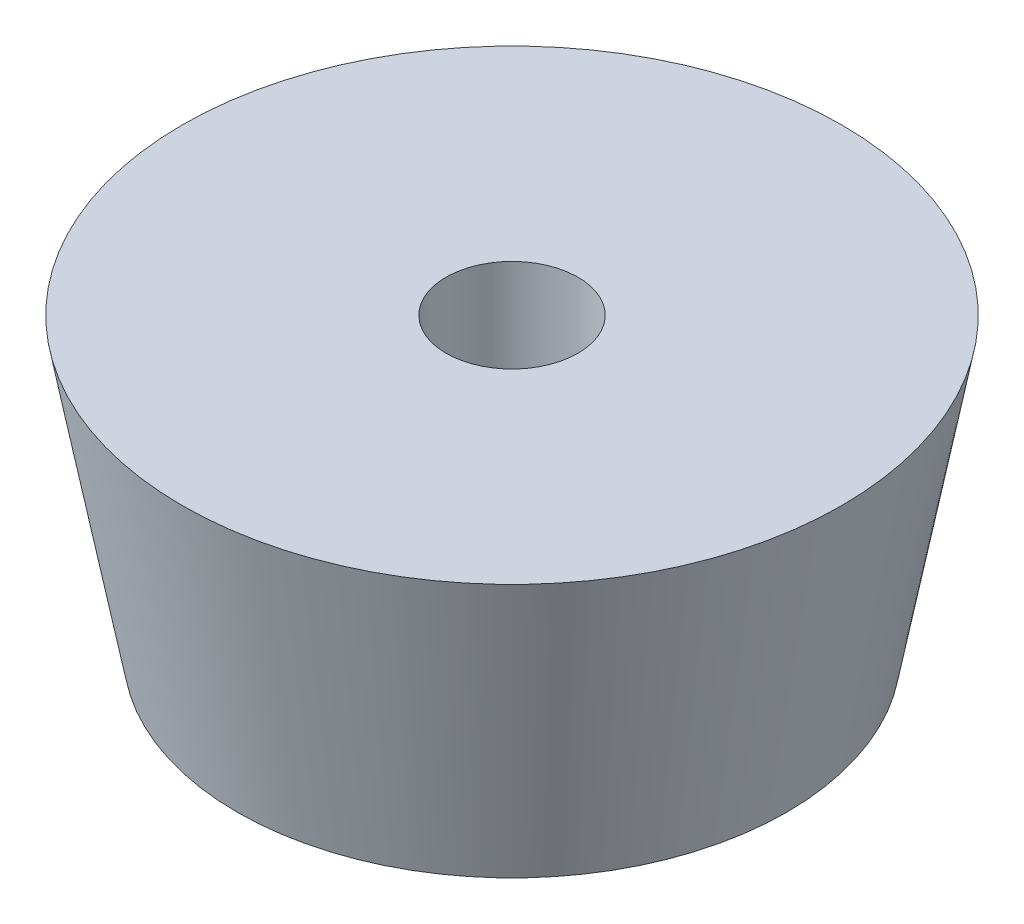
ISO-10303-21;
HEADER;
FILE_DESCRIPTION(('STEP AP214'),'2;1');
FILE_NAME('part.step','',(''),(''),'','','');
FILE_SCHEMA(('AUTOMOTIVE_DESIGN { 1 0 10303 214 1 1 1 1 }'));
ENDSEC;
DATA;
#1=APPLICATION_CONTEXT('core data for automotive mechanical design processes');
#2=APPLICATION_PROTOCOL_DEFINITION('international standard','automotive_design',2000,#1);
#3=PRODUCT_CONTEXT('',#1,'mechanical');
#4=PRODUCT('Part','Part','',(#3));
#5=PRODUCT_RELATED_PRODUCT_CATEGORY('part','',(#4));
#6=PRODUCT_DEFINITION_FORMATION('','',#4);
#7=PRODUCT_DEFINITION_CONTEXT('part definition',#1,'design');
#8=PRODUCT_DEFINITION('design','',#6,#7);
#9=PRODUCT_DEFINITION_SHAPE('','',#8);
#10=(LENGTH_UNIT() NAMED_UNIT(*) SI_UNIT(.MILLI.,.METRE.));
#11=(NAMED_UNIT(*) PLANE_ANGLE_UNIT() SI_UNIT($,.RADIAN.));
#12=(NAMED_UNIT(*) SI_UNIT($,.STERADIAN.) SOLID_ANGLE_UNIT());
#13=UNCERTAINTY_MEASURE_WITH_UNIT(LENGTH_MEASURE(1.E-05),#10,'distance_accuracy_value','');
#14=(GEOMETRIC_REPRESENTATION_CONTEXT(3) GLOBAL_UNCERTAINTY_ASSIGNED_CONTEXT((#13)) GLOBAL_UNIT_ASSIGNED_CONTEXT((#10,
#11,#12)) REPRESENTATION_CONTEXT('',''));
#15=CARTESIAN_POINT('',(0.,0.,0.));
#16=DIRECTION('',(0.,0.,1.));
#17=DIRECTION('',(1.,0.,0.));
#18=AXIS2_PLACEMENT_3D('',#15,#16,#17);
#19=CARTESIAN_POINT('',(-7.5,0.,0.));
#20=DIRECTION('',(0.,1.,0.));
#21=DIRECTION('',(-1.,0.,0.));
#22=AXIS2_PLACEMENT_3D('',#19,#20,#21);
#23=PLANE('',#22);
#24=CARTESIAN_POINT('',(0.,0.,0.));
#25=DIRECTION('',(0.,-1.,0.));
#26=DIRECTION('',(1.,0.,0.));
#27=AXIS2_PLACEMENT_3D('',#24,#25,#26);
#28=CIRCLE('',#27,4.);
#29=CARTESIAN_POINT('',(4.,0.,0.));
#30=VERTEX_POINT('',#29);
#31=EDGE_CURVE('E10',#30,#30,#28,.T.);
#32=ORIENTED_EDGE('',*,*,#31,.F.);
#33=EDGE_LOOP('',(#32));
#34=FACE_BOUND('',#33,.T.);
#35=CARTESIAN_POINT('',(0.,0.,0.));
#36=DIRECTION('',(0.,-1.,0.));
#37=DIRECTION('',(1.,0.,0.));
#38=AXIS2_PLACEMENT_3D('',#35,#36,#37);
#39=CIRCLE('',#38,7.5);
#40=CARTESIAN_POINT('',(7.5,0.,0.));
#41=VERTEX_POINT('',#40);
#42=EDGE_CURVE('E54',#41,#41,#39,.T.);
#43=ORIENTED_EDGE('',*,*,#42,.T.);
#44=EDGE_LOOP('',(#43));
#45=FACE_BOUND('',#44,.T.);
#46=ADVANCED_FACE('F32',(#34,#45),#23,.F.);
#47=CARTESIAN_POINT('',(0.,0.,0.));
#48=DIRECTION('',(0.,-1.,0.));
#49=DIRECTION('',(1.,0.,0.));
#50=AXIS2_PLACEMENT_3D('',#47,#48,#49);
#51=CYLINDRICAL_SURFACE('',#50,4.);
#52=CARTESIAN_POINT('',(0.,4.,0.));
#53=DIRECTION('',(0.,-1.,0.));
#54=DIRECTION('',(1.,0.,0.));
#55=AXIS2_PLACEMENT_3D('',#52,#53,#54);
#56=CIRCLE('',#55,4.);
#57=CARTESIAN_POINT('',(4.,4.,0.));
#58=VERTEX_POINT('',#57);
#59=EDGE_CURVE('E38',#58,#58,#56,.T.);
#60=ORIENTED_EDGE('',*,*,#59,.F.);
#61=EDGE_LOOP('',(#60));
#62=FACE_BOUND('',#61,.T.);
#63=ORIENTED_EDGE('',*,*,#31,.T.);
#64=EDGE_LOOP('',(#63));
#65=FACE_BOUND('',#64,.T.);
#66=ADVANCED_FACE('F79',(#62,#65),#51,.F.);
#67=CARTESIAN_POINT('',(-4.,4.,0.));
#68=DIRECTION('',(0.,1.,0.));
#69=DIRECTION('',(-1.,0.,0.));
#70=AXIS2_PLACEMENT_3D('',#67,#68,#69);
#71=PLANE('',#70);
#72=CARTESIAN_POINT('',(0.,4.,0.));
#73=DIRECTION('',(0.,-1.,0.));
#74=DIRECTION('',(1.,0.,0.));
#75=AXIS2_PLACEMENT_3D('',#72,#73,#74);
#76=CIRCLE('',#75,1.8);
#77=CARTESIAN_POINT('',(1.8,4.,0.));
#78=VERTEX_POINT('',#77);
#79=EDGE_CURVE('E42',#78,#78,#76,.T.);
#80=ORIENTED_EDGE('',*,*,#79,.F.);
#81=EDGE_LOOP('',(#80));
#82=FACE_BOUND('',#81,.T.);
#83=ORIENTED_EDGE('',*,*,#59,.T.);
#84=EDGE_LOOP('',(#83));
#85=FACE_BOUND('',#84,.T.);
#86=ADVANCED_FACE('F74',(#82,#85),#71,.F.);
#87=CARTESIAN_POINT('',(0.,0.,0.));
#88=DIRECTION('',(0.,-1.,0.));
#89=DIRECTION('',(1.,0.,0.));
#90=AXIS2_PLACEMENT_3D('',#87,#88,#89);
#91=CYLINDRICAL_SURFACE('',#90,1.8);
#92=CARTESIAN_POINT('',(0.,8.,0.));
#93=DIRECTION('',(0.,-1.,0.));
#94=DIRECTION('',(1.,0.,0.));
#95=AXIS2_PLACEMENT_3D('',#92,#93,#94);
#96=CIRCLE('',#95,1.8);
#97=CARTESIAN_POINT('',(1.8,8.,0.));
#98=VERTEX_POINT('',#97);
#99=EDGE_CURVE('E46',#98,#98,#96,.T.);
#100=ORIENTED_EDGE('',*,*,#99,.F.);
#101=EDGE_LOOP('',(#100));
#102=FACE_BOUND('',#101,.T.);
#103=ORIENTED_EDGE('',*,*,#79,.T.);
#104=EDGE_LOOP('',(#103));
#105=FACE_BOUND('',#104,.T.);
#106=ADVANCED_FACE('F68',(#102,#105),#91,.F.);
#107=CARTESIAN_POINT('',(-1.8,8.,0.));
#108=DIRECTION('',(0.,-1.,0.));
#109=DIRECTION('',(1.,0.,0.));
#110=AXIS2_PLACEMENT_3D('',#107,#108,#109);
#111=PLANE('',#110);
#112=CARTESIAN_POINT('',(0.,8.,0.));
#113=DIRECTION('',(0.,-1.,0.));
#114=DIRECTION('',(1.,0.,0.));
#115=AXIS2_PLACEMENT_3D('',#112,#113,#114);
#116=CIRCLE('',#115,9.);
#117=CARTESIAN_POINT('',(9.,8.,0.));
#118=VERTEX_POINT('',#117);
#119=EDGE_CURVE('E51',#118,#118,#116,.T.);
#120=ORIENTED_EDGE('',*,*,#119,.F.);
#121=EDGE_LOOP('',(#120));
#122=FACE_BOUND('',#121,.T.);
#123=ORIENTED_EDGE('',*,*,#99,.T.);
#124=EDGE_LOOP('',(#123));
#125=FACE_BOUND('',#124,.T.);
#126=ADVANCED_FACE('F62',(#122,#125),#111,.F.);
#127=CARTESIAN_POINT('',(0.,8.,0.));
#128=DIRECTION('',(0.,1.,0.));
#129=DIRECTION('',(-1.,0.,0.));
#130=AXIS2_PLACEMENT_3D('',#127,#128,#129);
#131=CONICAL_SURFACE('',#130,9.,0.185347949995695);
#132=ORIENTED_EDGE('',*,*,#42,.F.);
#133=EDGE_LOOP('',(#132));
#134=FACE_BOUND('',#133,.T.);
#135=ORIENTED_EDGE('',*,*,#119,.T.);
#136=EDGE_LOOP('',(#135));
#137=FACE_BOUND('',#136,.T.);
#138=ADVANCED_FACE('F59',(#134,#137),#131,.T.);
#139=CLOSED_SHELL('',(#46,#66,#86,#106,#126,#138));
#140=MANIFOLD_SOLID_BREP('B2',#139);
#141=ADVANCED_BREP_SHAPE_REPRESENTATION('',(#18,#140),#14);
#142=SHAPE_DEFINITION_REPRESENTATION(#9,#141);
ENDSEC;
END-ISO-10303-21;
